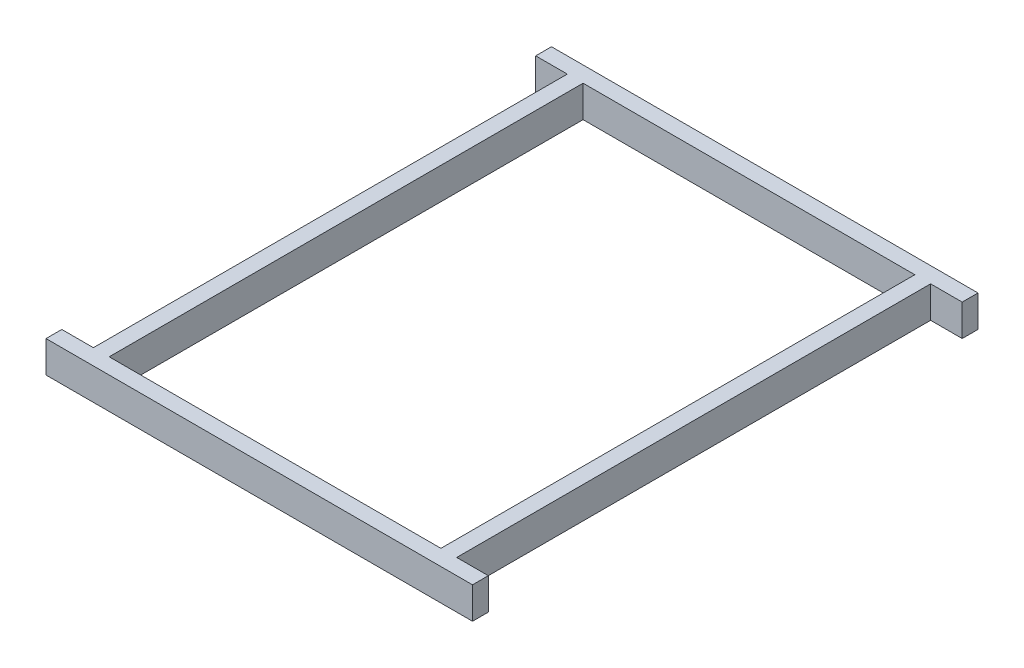
ISO-10303-21;
HEADER;
FILE_DESCRIPTION(('STEP AP214'),'2;1');
FILE_NAME('part.step','',(''),(''),'','','');
FILE_SCHEMA(('AUTOMOTIVE_DESIGN { 1 0 10303 214 1 1 1 1 }'));
ENDSEC;
DATA;
#1=APPLICATION_CONTEXT('core data for automotive mechanical design processes');
#2=APPLICATION_PROTOCOL_DEFINITION('international standard','automotive_design',2000,#1);
#3=PRODUCT_CONTEXT('',#1,'mechanical');
#4=PRODUCT('Part','Part','',(#3));
#5=PRODUCT_RELATED_PRODUCT_CATEGORY('part','',(#4));
#6=PRODUCT_DEFINITION_FORMATION('','',#4);
#7=PRODUCT_DEFINITION_CONTEXT('part definition',#1,'design');
#8=PRODUCT_DEFINITION('design','',#6,#7);
#9=PRODUCT_DEFINITION_SHAPE('','',#8);
#10=(LENGTH_UNIT() NAMED_UNIT(*) SI_UNIT(.MILLI.,.METRE.));
#11=(NAMED_UNIT(*) PLANE_ANGLE_UNIT() SI_UNIT($,.RADIAN.));
#12=(NAMED_UNIT(*) SI_UNIT($,.STERADIAN.) SOLID_ANGLE_UNIT());
#13=UNCERTAINTY_MEASURE_WITH_UNIT(LENGTH_MEASURE(1.E-05),#10,'distance_accuracy_value','');
#14=(GEOMETRIC_REPRESENTATION_CONTEXT(3) GLOBAL_UNCERTAINTY_ASSIGNED_CONTEXT((#13)) GLOBAL_UNIT_ASSIGNED_CONTEXT((#10,
#11,#12)) REPRESENTATION_CONTEXT('',''));
#15=CARTESIAN_POINT('',(0.,0.,0.));
#16=DIRECTION('',(0.,0.,1.));
#17=DIRECTION('',(1.,0.,0.));
#18=AXIS2_PLACEMENT_3D('',#15,#16,#17);
#19=CARTESIAN_POINT('',(0.,50.8,0.));
#20=DIRECTION('',(0.,1.,0.));
#21=DIRECTION('',(0.,0.,1.));
#22=AXIS2_PLACEMENT_3D('',#19,#20,#21);
#23=PLANE('',#22);
#24=DIRECTION('',(0.,0.,1.));
#25=VECTOR('',#24,1.);
#26=CARTESIAN_POINT('',(-342.9,50.8,-25.4));
#27=LINE('',#26,#25);
#28=CARTESIAN_POINT('',(-342.9,50.8,-25.4));
#29=VERTEX_POINT('',#28);
#30=CARTESIAN_POINT('',(-342.9,50.8,0.));
#31=VERTEX_POINT('',#30);
#32=EDGE_CURVE('E182',#29,#31,#27,.T.);
#33=ORIENTED_EDGE('',*,*,#32,.T.);
#34=DIRECTION('',(1.,0.,0.));
#35=VECTOR('',#34,1.);
#36=CARTESIAN_POINT('',(-342.9,50.8,0.));
#37=LINE('',#36,#35);
#38=CARTESIAN_POINT('',(342.9,50.8,-1.25979416228288E-13));
#39=VERTEX_POINT('',#38);
#40=EDGE_CURVE('E185',#31,#39,#37,.T.);
#41=ORIENTED_EDGE('',*,*,#40,.T.);
#42=DIRECTION('',(0.,0.,-1.));
#43=VECTOR('',#42,1.);
#44=CARTESIAN_POINT('',(342.9,50.8,-1.25979416228288E-13));
#45=LINE('',#44,#43);
#46=CARTESIAN_POINT('',(342.9,50.8,-25.4));
#47=VERTEX_POINT('',#46);
#48=EDGE_CURVE('E188',#39,#47,#45,.T.);
#49=ORIENTED_EDGE('',*,*,#48,.T.);
#50=DIRECTION('',(-1.,0.,0.));
#51=VECTOR('',#50,1.);
#52=CARTESIAN_POINT('',(342.9,50.8,-25.4));
#53=LINE('',#52,#51);
#54=CARTESIAN_POINT('',(292.1,50.8,-25.4));
#55=VERTEX_POINT('',#54);
#56=EDGE_CURVE('E190',#47,#55,#53,.T.);
#57=ORIENTED_EDGE('',*,*,#56,.T.);
#58=DIRECTION('',(0.,0.,-1.));
#59=VECTOR('',#58,1.);
#60=CARTESIAN_POINT('',(292.1,50.8,-25.4));
#61=LINE('',#60,#59);
#62=CARTESIAN_POINT('',(292.1,50.8,-787.4));
#63=VERTEX_POINT('',#62);
#64=EDGE_CURVE('E192',#55,#63,#61,.T.);
#65=ORIENTED_EDGE('',*,*,#64,.T.);
#66=DIRECTION('',(1.,0.,0.));
#67=VECTOR('',#66,1.);
#68=CARTESIAN_POINT('',(292.1,50.8,-787.4));
#69=LINE('',#68,#67);
#70=CARTESIAN_POINT('',(342.9,50.8,-787.4));
#71=VERTEX_POINT('',#70);
#72=EDGE_CURVE('E194',#63,#71,#69,.T.);
#73=ORIENTED_EDGE('',*,*,#72,.T.);
#74=DIRECTION('',(0.,0.,-1.));
#75=VECTOR('',#74,1.);
#76=CARTESIAN_POINT('',(342.9,50.8,-787.4));
#77=LINE('',#76,#75);
#78=CARTESIAN_POINT('',(342.9,50.8,-812.8));
#79=VERTEX_POINT('',#78);
#80=EDGE_CURVE('E196',#71,#79,#77,.T.);
#81=ORIENTED_EDGE('',*,*,#80,.T.);
#82=DIRECTION('',(-1.,0.,0.));
#83=VECTOR('',#82,1.);
#84=CARTESIAN_POINT('',(342.9,50.8,-812.8));
#85=LINE('',#84,#83);
#86=CARTESIAN_POINT('',(-342.9,50.8,-812.8));
#87=VERTEX_POINT('',#86);
#88=EDGE_CURVE('E198',#79,#87,#85,.T.);
#89=ORIENTED_EDGE('',*,*,#88,.T.);
#90=DIRECTION('',(0.,0.,1.));
#91=VECTOR('',#90,1.);
#92=CARTESIAN_POINT('',(-342.9,50.8,-812.8));
#93=LINE('',#92,#91);
#94=CARTESIAN_POINT('',(-342.9,50.8,-787.4));
#95=VERTEX_POINT('',#94);
#96=EDGE_CURVE('E200',#87,#95,#93,.T.);
#97=ORIENTED_EDGE('',*,*,#96,.T.);
#98=DIRECTION('',(1.,0.,0.));
#99=VECTOR('',#98,1.);
#100=CARTESIAN_POINT('',(-342.9,50.8,-787.4));
#101=LINE('',#100,#99);
#102=CARTESIAN_POINT('',(-292.1,50.8,-787.4));
#103=VERTEX_POINT('',#102);
#104=EDGE_CURVE('E202',#95,#103,#101,.T.);
#105=ORIENTED_EDGE('',*,*,#104,.T.);
#106=DIRECTION('',(0.,0.,1.));
#107=VECTOR('',#106,1.);
#108=CARTESIAN_POINT('',(-292.1,50.8,-787.4));
#109=LINE('',#108,#107);
#110=CARTESIAN_POINT('',(-292.1,50.8,-25.3999999999999));
#111=VERTEX_POINT('',#110);
#112=EDGE_CURVE('E204',#103,#111,#109,.T.);
#113=ORIENTED_EDGE('',*,*,#112,.T.);
#114=DIRECTION('',(-1.,0.,0.));
#115=VECTOR('',#114,1.);
#116=CARTESIAN_POINT('',(-292.1,50.8,-25.3999999999999));
#117=LINE('',#116,#115);
#118=EDGE_CURVE('E206',#111,#29,#117,.T.);
#119=ORIENTED_EDGE('',*,*,#118,.T.);
#120=EDGE_LOOP('',(#33,#41,#49,#57,#65,#73,#81,#89,#97,#105,#113,#119));
#121=FACE_BOUND('',#120,.T.);
#122=DIRECTION('',(1.,0.,0.));
#123=VECTOR('',#122,1.);
#124=CARTESIAN_POINT('',(-266.7,50.8,-25.4));
#125=LINE('',#124,#123);
#126=CARTESIAN_POINT('',(-266.7,50.8,-25.4));
#127=VERTEX_POINT('',#126);
#128=CARTESIAN_POINT('',(266.7,50.8,-25.4));
#129=VERTEX_POINT('',#128);
#130=EDGE_CURVE('E154',#127,#129,#125,.T.);
#131=ORIENTED_EDGE('',*,*,#130,.F.);
#132=DIRECTION('',(0.,0.,1.));
#133=VECTOR('',#132,1.);
#134=CARTESIAN_POINT('',(-266.7,50.8,-787.4));
#135=LINE('',#134,#133);
#136=CARTESIAN_POINT('',(-266.7,50.8,-787.4));
#137=VERTEX_POINT('',#136);
#138=EDGE_CURVE('E146',#137,#127,#135,.T.);
#139=ORIENTED_EDGE('',*,*,#138,.F.);
#140=DIRECTION('',(-1.,0.,0.));
#141=VECTOR('',#140,1.);
#142=CARTESIAN_POINT('',(-266.7,50.8,-787.4));
#143=LINE('',#142,#141);
#144=CARTESIAN_POINT('',(266.7,50.8,-787.4));
#145=VERTEX_POINT('',#144);
#146=EDGE_CURVE('E168',#145,#137,#143,.T.);
#147=ORIENTED_EDGE('',*,*,#146,.F.);
#148=DIRECTION('',(0.,0.,-1.));
#149=VECTOR('',#148,1.);
#150=CARTESIAN_POINT('',(266.7,50.8,-787.4));
#151=LINE('',#150,#149);
#152=EDGE_CURVE('E166',#129,#145,#151,.T.);
#153=ORIENTED_EDGE('',*,*,#152,.F.);
#154=EDGE_LOOP('',(#131,#139,#147,#153));
#155=FACE_BOUND('',#154,.T.);
#156=ADVANCED_FACE('F33',(#121,#155),#23,.T.);
#157=CARTESIAN_POINT('',(0.,0.,0.));
#158=DIRECTION('',(0.,1.,0.));
#159=DIRECTION('',(0.,0.,1.));
#160=AXIS2_PLACEMENT_3D('',#157,#158,#159);
#161=PLANE('',#160);
#162=DIRECTION('',(0.,0.,1.));
#163=VECTOR('',#162,1.);
#164=CARTESIAN_POINT('',(-342.9,0.,-25.4));
#165=LINE('',#164,#163);
#166=CARTESIAN_POINT('',(-342.9,0.,-25.4));
#167=VERTEX_POINT('',#166);
#168=CARTESIAN_POINT('',(-342.9,0.,0.));
#169=VERTEX_POINT('',#168);
#170=EDGE_CURVE('E162',#167,#169,#165,.T.);
#171=ORIENTED_EDGE('',*,*,#170,.F.);
#172=DIRECTION('',(-1.,0.,0.));
#173=VECTOR('',#172,1.);
#174=CARTESIAN_POINT('',(-292.1,0.,-25.3999999999999));
#175=LINE('',#174,#173);
#176=CARTESIAN_POINT('',(-292.1,0.,-25.3999999999999));
#177=VERTEX_POINT('',#176);
#178=EDGE_CURVE('E186',#177,#167,#175,.T.);
#179=ORIENTED_EDGE('',*,*,#178,.F.);
#180=DIRECTION('',(0.,0.,1.));
#181=VECTOR('',#180,1.);
#182=CARTESIAN_POINT('',(-292.1,0.,-787.4));
#183=LINE('',#182,#181);
#184=CARTESIAN_POINT('',(-292.1,0.,-787.4));
#185=VERTEX_POINT('',#184);
#186=EDGE_CURVE('E229',#185,#177,#183,.T.);
#187=ORIENTED_EDGE('',*,*,#186,.F.);
#188=DIRECTION('',(1.,0.,0.));
#189=VECTOR('',#188,1.);
#190=CARTESIAN_POINT('',(-342.9,0.,-787.4));
#191=LINE('',#190,#189);
#192=CARTESIAN_POINT('',(-342.9,0.,-787.4));
#193=VERTEX_POINT('',#192);
#194=EDGE_CURVE('E227',#193,#185,#191,.T.);
#195=ORIENTED_EDGE('',*,*,#194,.F.);
#196=DIRECTION('',(0.,0.,1.));
#197=VECTOR('',#196,1.);
#198=CARTESIAN_POINT('',(-342.9,0.,-812.8));
#199=LINE('',#198,#197);
#200=CARTESIAN_POINT('',(-342.9,0.,-812.8));
#201=VERTEX_POINT('',#200);
#202=EDGE_CURVE('E225',#201,#193,#199,.T.);
#203=ORIENTED_EDGE('',*,*,#202,.F.);
#204=DIRECTION('',(-1.,0.,0.));
#205=VECTOR('',#204,1.);
#206=CARTESIAN_POINT('',(342.9,0.,-812.8));
#207=LINE('',#206,#205);
#208=CARTESIAN_POINT('',(342.9,0.,-812.8));
#209=VERTEX_POINT('',#208);
#210=EDGE_CURVE('E223',#209,#201,#207,.T.);
#211=ORIENTED_EDGE('',*,*,#210,.F.);
#212=DIRECTION('',(0.,0.,-1.));
#213=VECTOR('',#212,1.);
#214=CARTESIAN_POINT('',(342.9,0.,-787.4));
#215=LINE('',#214,#213);
#216=CARTESIAN_POINT('',(342.9,0.,-787.4));
#217=VERTEX_POINT('',#216);
#218=EDGE_CURVE('E221',#217,#209,#215,.T.);
#219=ORIENTED_EDGE('',*,*,#218,.F.);
#220=DIRECTION('',(1.,0.,0.));
#221=VECTOR('',#220,1.);
#222=CARTESIAN_POINT('',(292.1,0.,-787.4));
#223=LINE('',#222,#221);
#224=CARTESIAN_POINT('',(292.1,0.,-787.4));
#225=VERTEX_POINT('',#224);
#226=EDGE_CURVE('E219',#225,#217,#223,.T.);
#227=ORIENTED_EDGE('',*,*,#226,.F.);
#228=DIRECTION('',(0.,0.,-1.));
#229=VECTOR('',#228,1.);
#230=CARTESIAN_POINT('',(292.1,0.,-25.4));
#231=LINE('',#230,#229);
#232=CARTESIAN_POINT('',(292.1,0.,-25.4));
#233=VERTEX_POINT('',#232);
#234=EDGE_CURVE('E217',#233,#225,#231,.T.);
#235=ORIENTED_EDGE('',*,*,#234,.F.);
#236=DIRECTION('',(-1.,0.,0.));
#237=VECTOR('',#236,1.);
#238=CARTESIAN_POINT('',(342.9,0.,-25.4));
#239=LINE('',#238,#237);
#240=CARTESIAN_POINT('',(342.9,0.,-25.4));
#241=VERTEX_POINT('',#240);
#242=EDGE_CURVE('E215',#241,#233,#239,.T.);
#243=ORIENTED_EDGE('',*,*,#242,.F.);
#244=DIRECTION('',(0.,0.,-1.));
#245=VECTOR('',#244,1.);
#246=CARTESIAN_POINT('',(342.9,0.,-1.25979416228288E-13));
#247=LINE('',#246,#245);
#248=CARTESIAN_POINT('',(342.9,0.,-1.25979416228288E-13));
#249=VERTEX_POINT('',#248);
#250=EDGE_CURVE('E213',#249,#241,#247,.T.);
#251=ORIENTED_EDGE('',*,*,#250,.F.);
#252=DIRECTION('',(1.,0.,0.));
#253=VECTOR('',#252,1.);
#254=CARTESIAN_POINT('',(-342.9,0.,0.));
#255=LINE('',#254,#253);
#256=EDGE_CURVE('E211',#169,#249,#255,.T.);
#257=ORIENTED_EDGE('',*,*,#256,.F.);
#258=EDGE_LOOP('',(#171,#179,#187,#195,#203,#211,#219,#227,#235,#243,#251,#257));
#259=FACE_BOUND('',#258,.T.);
#260=DIRECTION('',(0.,0.,1.));
#261=VECTOR('',#260,1.);
#262=CARTESIAN_POINT('',(-266.7,0.,-787.4));
#263=LINE('',#262,#261);
#264=CARTESIAN_POINT('',(-266.7,0.,-787.4));
#265=VERTEX_POINT('',#264);
#266=CARTESIAN_POINT('',(-266.7,0.,-25.4));
#267=VERTEX_POINT('',#266);
#268=EDGE_CURVE('E56',#265,#267,#263,.T.);
#269=ORIENTED_EDGE('',*,*,#268,.T.);
#270=DIRECTION('',(1.,0.,0.));
#271=VECTOR('',#270,1.);
#272=CARTESIAN_POINT('',(-266.7,0.,-25.4));
#273=LINE('',#272,#271);
#274=CARTESIAN_POINT('',(266.7,0.,-25.4));
#275=VERTEX_POINT('',#274);
#276=EDGE_CURVE('E161',#267,#275,#273,.T.);
#277=ORIENTED_EDGE('',*,*,#276,.T.);
#278=DIRECTION('',(0.,0.,-1.));
#279=VECTOR('',#278,1.);
#280=CARTESIAN_POINT('',(266.7,0.,-787.4));
#281=LINE('',#280,#279);
#282=CARTESIAN_POINT('',(266.7,0.,-787.4));
#283=VERTEX_POINT('',#282);
#284=EDGE_CURVE('E174',#275,#283,#281,.T.);
#285=ORIENTED_EDGE('',*,*,#284,.T.);
#286=DIRECTION('',(-1.,0.,0.));
#287=VECTOR('',#286,1.);
#288=CARTESIAN_POINT('',(-266.7,0.,-787.4));
#289=LINE('',#288,#287);
#290=EDGE_CURVE('E155',#283,#265,#289,.T.);
#291=ORIENTED_EDGE('',*,*,#290,.T.);
#292=EDGE_LOOP('',(#269,#277,#285,#291));
#293=FACE_BOUND('',#292,.T.);
#294=ADVANCED_FACE('F271',(#259,#293),#161,.F.);
#295=CARTESIAN_POINT('',(-342.9,50.8,-25.4));
#296=DIRECTION('',(1.,0.,0.));
#297=DIRECTION('',(0.,0.,-1.));
#298=AXIS2_PLACEMENT_3D('',#295,#296,#297);
#299=PLANE('',#298);
#300=ORIENTED_EDGE('',*,*,#170,.T.);
#301=DIRECTION('',(0.,-1.,0.));
#302=VECTOR('',#301,1.);
#303=CARTESIAN_POINT('',(-342.9,50.8,0.));
#304=LINE('',#303,#302);
#305=EDGE_CURVE('E11',#31,#169,#304,.T.);
#306=ORIENTED_EDGE('',*,*,#305,.F.);
#307=ORIENTED_EDGE('',*,*,#32,.F.);
#308=DIRECTION('',(0.,-1.,0.));
#309=VECTOR('',#308,1.);
#310=CARTESIAN_POINT('',(-342.9,50.8,-25.4));
#311=LINE('',#310,#309);
#312=EDGE_CURVE('E208',#29,#167,#311,.T.);
#313=ORIENTED_EDGE('',*,*,#312,.T.);
#314=EDGE_LOOP('',(#300,#306,#307,#313));
#315=FACE_BOUND('',#314,.T.);
#316=ADVANCED_FACE('F35',(#315),#299,.F.);
#317=CARTESIAN_POINT('',(-342.9,50.8,0.));
#318=DIRECTION('',(0.,0.,-1.));
#319=DIRECTION('',(-1.,0.,0.));
#320=AXIS2_PLACEMENT_3D('',#317,#318,#319);
#321=PLANE('',#320);
#322=ORIENTED_EDGE('',*,*,#256,.T.);
#323=DIRECTION('',(0.,-1.,0.));
#324=VECTOR('',#323,1.);
#325=CARTESIAN_POINT('',(342.9,50.8,-1.25979416228288E-13));
#326=LINE('',#325,#324);
#327=EDGE_CURVE('E41',#39,#249,#326,.T.);
#328=ORIENTED_EDGE('',*,*,#327,.F.);
#329=ORIENTED_EDGE('',*,*,#40,.F.);
#330=ORIENTED_EDGE('',*,*,#305,.T.);
#331=EDGE_LOOP('',(#322,#328,#329,#330));
#332=FACE_BOUND('',#331,.T.);
#333=ADVANCED_FACE('F288',(#332),#321,.F.);
#334=CARTESIAN_POINT('',(342.9,50.8,-1.25979416228288E-13));
#335=DIRECTION('',(-1.,0.,0.));
#336=DIRECTION('',(0.,0.,1.));
#337=AXIS2_PLACEMENT_3D('',#334,#335,#336);
#338=PLANE('',#337);
#339=ORIENTED_EDGE('',*,*,#250,.T.);
#340=DIRECTION('',(0.,-1.,0.));
#341=VECTOR('',#340,1.);
#342=CARTESIAN_POINT('',(342.9,50.8,-25.4));
#343=LINE('',#342,#341);
#344=EDGE_CURVE('E258',#47,#241,#343,.T.);
#345=ORIENTED_EDGE('',*,*,#344,.F.);
#346=ORIENTED_EDGE('',*,*,#48,.F.);
#347=ORIENTED_EDGE('',*,*,#327,.T.);
#348=EDGE_LOOP('',(#339,#345,#346,#347));
#349=FACE_BOUND('',#348,.T.);
#350=ADVANCED_FACE('F265',(#349),#338,.F.);
#351=CARTESIAN_POINT('',(342.9,50.8,-25.4));
#352=DIRECTION('',(0.,0.,1.));
#353=DIRECTION('',(1.,0.,0.));
#354=AXIS2_PLACEMENT_3D('',#351,#352,#353);
#355=PLANE('',#354);
#356=ORIENTED_EDGE('',*,*,#242,.T.);
#357=DIRECTION('',(0.,-1.,0.));
#358=VECTOR('',#357,1.);
#359=CARTESIAN_POINT('',(292.1,50.8,-25.4));
#360=LINE('',#359,#358);
#361=EDGE_CURVE('E255',#55,#233,#360,.T.);
#362=ORIENTED_EDGE('',*,*,#361,.F.);
#363=ORIENTED_EDGE('',*,*,#56,.F.);
#364=ORIENTED_EDGE('',*,*,#344,.T.);
#365=EDGE_LOOP('',(#356,#362,#363,#364));
#366=FACE_BOUND('',#365,.T.);
#367=ADVANCED_FACE('F277',(#366),#355,.F.);
#368=CARTESIAN_POINT('',(292.1,50.8,-25.4));
#369=DIRECTION('',(-1.,0.,0.));
#370=DIRECTION('',(0.,0.,1.));
#371=AXIS2_PLACEMENT_3D('',#368,#369,#370);
#372=PLANE('',#371);
#373=ORIENTED_EDGE('',*,*,#234,.T.);
#374=DIRECTION('',(0.,-1.,0.));
#375=VECTOR('',#374,1.);
#376=CARTESIAN_POINT('',(292.1,50.8,-787.4));
#377=LINE('',#376,#375);
#378=EDGE_CURVE('E252',#63,#225,#377,.T.);
#379=ORIENTED_EDGE('',*,*,#378,.F.);
#380=ORIENTED_EDGE('',*,*,#64,.F.);
#381=ORIENTED_EDGE('',*,*,#361,.T.);
#382=EDGE_LOOP('',(#373,#379,#380,#381));
#383=FACE_BOUND('',#382,.T.);
#384=ADVANCED_FACE('F281',(#383),#372,.F.);
#385=CARTESIAN_POINT('',(292.1,50.8,-787.4));
#386=DIRECTION('',(0.,0.,-1.));
#387=DIRECTION('',(-1.,0.,0.));
#388=AXIS2_PLACEMENT_3D('',#385,#386,#387);
#389=PLANE('',#388);
#390=ORIENTED_EDGE('',*,*,#226,.T.);
#391=DIRECTION('',(0.,-1.,0.));
#392=VECTOR('',#391,1.);
#393=CARTESIAN_POINT('',(342.9,50.8,-787.4));
#394=LINE('',#393,#392);
#395=EDGE_CURVE('E249',#71,#217,#394,.T.);
#396=ORIENTED_EDGE('',*,*,#395,.F.);
#397=ORIENTED_EDGE('',*,*,#72,.F.);
#398=ORIENTED_EDGE('',*,*,#378,.T.);
#399=EDGE_LOOP('',(#390,#396,#397,#398));
#400=FACE_BOUND('',#399,.T.);
#401=ADVANCED_FACE('F321',(#400),#389,.F.);
#402=CARTESIAN_POINT('',(342.9,50.8,-787.4));
#403=DIRECTION('',(-1.,0.,0.));
#404=DIRECTION('',(0.,0.,1.));
#405=AXIS2_PLACEMENT_3D('',#402,#403,#404);
#406=PLANE('',#405);
#407=ORIENTED_EDGE('',*,*,#218,.T.);
#408=DIRECTION('',(0.,-1.,0.));
#409=VECTOR('',#408,1.);
#410=CARTESIAN_POINT('',(342.9,50.8,-812.8));
#411=LINE('',#410,#409);
#412=EDGE_CURVE('E246',#79,#209,#411,.T.);
#413=ORIENTED_EDGE('',*,*,#412,.F.);
#414=ORIENTED_EDGE('',*,*,#80,.F.);
#415=ORIENTED_EDGE('',*,*,#395,.T.);
#416=EDGE_LOOP('',(#407,#413,#414,#415));
#417=FACE_BOUND('',#416,.T.);
#418=ADVANCED_FACE('F319',(#417),#406,.F.);
#419=CARTESIAN_POINT('',(342.9,50.8,-812.8));
#420=DIRECTION('',(0.,0.,1.));
#421=DIRECTION('',(1.,0.,0.));
#422=AXIS2_PLACEMENT_3D('',#419,#420,#421);
#423=PLANE('',#422);
#424=ORIENTED_EDGE('',*,*,#210,.T.);
#425=DIRECTION('',(0.,-1.,0.));
#426=VECTOR('',#425,1.);
#427=CARTESIAN_POINT('',(-342.9,50.8,-812.8));
#428=LINE('',#427,#426);
#429=EDGE_CURVE('E243',#87,#201,#428,.T.);
#430=ORIENTED_EDGE('',*,*,#429,.F.);
#431=ORIENTED_EDGE('',*,*,#88,.F.);
#432=ORIENTED_EDGE('',*,*,#412,.T.);
#433=EDGE_LOOP('',(#424,#430,#431,#432));
#434=FACE_BOUND('',#433,.T.);
#435=ADVANCED_FACE('F315',(#434),#423,.F.);
#436=CARTESIAN_POINT('',(-342.9,50.8,-812.8));
#437=DIRECTION('',(1.,0.,0.));
#438=DIRECTION('',(0.,0.,-1.));
#439=AXIS2_PLACEMENT_3D('',#436,#437,#438);
#440=PLANE('',#439);
#441=ORIENTED_EDGE('',*,*,#202,.T.);
#442=DIRECTION('',(0.,-1.,0.));
#443=VECTOR('',#442,1.);
#444=CARTESIAN_POINT('',(-342.9,50.8,-787.4));
#445=LINE('',#444,#443);
#446=EDGE_CURVE('E240',#95,#193,#445,.T.);
#447=ORIENTED_EDGE('',*,*,#446,.F.);
#448=ORIENTED_EDGE('',*,*,#96,.F.);
#449=ORIENTED_EDGE('',*,*,#429,.T.);
#450=EDGE_LOOP('',(#441,#447,#448,#449));
#451=FACE_BOUND('',#450,.T.);
#452=ADVANCED_FACE('F310',(#451),#440,.F.);
#453=CARTESIAN_POINT('',(-342.9,50.8,-787.4));
#454=DIRECTION('',(0.,0.,-1.));
#455=DIRECTION('',(-1.,0.,0.));
#456=AXIS2_PLACEMENT_3D('',#453,#454,#455);
#457=PLANE('',#456);
#458=ORIENTED_EDGE('',*,*,#194,.T.);
#459=DIRECTION('',(0.,-1.,0.));
#460=VECTOR('',#459,1.);
#461=CARTESIAN_POINT('',(-292.1,50.8,-787.4));
#462=LINE('',#461,#460);
#463=EDGE_CURVE('E237',#103,#185,#462,.T.);
#464=ORIENTED_EDGE('',*,*,#463,.F.);
#465=ORIENTED_EDGE('',*,*,#104,.F.);
#466=ORIENTED_EDGE('',*,*,#446,.T.);
#467=EDGE_LOOP('',(#458,#464,#465,#466));
#468=FACE_BOUND('',#467,.T.);
#469=ADVANCED_FACE('F304',(#468),#457,.F.);
#470=CARTESIAN_POINT('',(-292.1,50.8,-787.4));
#471=DIRECTION('',(1.,0.,0.));
#472=DIRECTION('',(0.,0.,-1.));
#473=AXIS2_PLACEMENT_3D('',#470,#471,#472);
#474=PLANE('',#473);
#475=ORIENTED_EDGE('',*,*,#186,.T.);
#476=DIRECTION('',(0.,-1.,0.));
#477=VECTOR('',#476,1.);
#478=CARTESIAN_POINT('',(-292.1,50.8,-25.3999999999999));
#479=LINE('',#478,#477);
#480=EDGE_CURVE('E234',#111,#177,#479,.T.);
#481=ORIENTED_EDGE('',*,*,#480,.F.);
#482=ORIENTED_EDGE('',*,*,#112,.F.);
#483=ORIENTED_EDGE('',*,*,#463,.T.);
#484=EDGE_LOOP('',(#475,#481,#482,#483));
#485=FACE_BOUND('',#484,.T.);
#486=ADVANCED_FACE('F300',(#485),#474,.F.);
#487=CARTESIAN_POINT('',(-292.1,50.8,-25.3999999999999));
#488=DIRECTION('',(0.,0.,1.));
#489=DIRECTION('',(1.,0.,0.));
#490=AXIS2_PLACEMENT_3D('',#487,#488,#489);
#491=PLANE('',#490);
#492=ORIENTED_EDGE('',*,*,#178,.T.);
#493=ORIENTED_EDGE('',*,*,#312,.F.);
#494=ORIENTED_EDGE('',*,*,#118,.F.);
#495=ORIENTED_EDGE('',*,*,#480,.T.);
#496=EDGE_LOOP('',(#492,#493,#494,#495));
#497=FACE_BOUND('',#496,.T.);
#498=ADVANCED_FACE('F295',(#497),#491,.F.);
#499=CARTESIAN_POINT('',(-266.7,50.8,-787.4));
#500=DIRECTION('',(1.,0.,0.));
#501=DIRECTION('',(0.,0.,-1.));
#502=AXIS2_PLACEMENT_3D('',#499,#500,#501);
#503=PLANE('',#502);
#504=ORIENTED_EDGE('',*,*,#268,.F.);
#505=DIRECTION('',(0.,-1.,0.));
#506=VECTOR('',#505,1.);
#507=CARTESIAN_POINT('',(-266.7,50.8,-787.4));
#508=LINE('',#507,#506);
#509=EDGE_CURVE('E150',#137,#265,#508,.T.);
#510=ORIENTED_EDGE('',*,*,#509,.F.);
#511=ORIENTED_EDGE('',*,*,#138,.T.);
#512=DIRECTION('',(0.,-1.,0.));
#513=VECTOR('',#512,1.);
#514=CARTESIAN_POINT('',(-266.7,50.8,-25.4));
#515=LINE('',#514,#513);
#516=EDGE_CURVE('E149',#127,#267,#515,.T.);
#517=ORIENTED_EDGE('',*,*,#516,.T.);
#518=EDGE_LOOP('',(#504,#510,#511,#517));
#519=FACE_BOUND('',#518,.T.);
#520=ADVANCED_FACE('F148',(#519),#503,.T.);
#521=CARTESIAN_POINT('',(-266.7,50.8,-25.4));
#522=DIRECTION('',(0.,0.,-1.));
#523=DIRECTION('',(-1.,0.,0.));
#524=AXIS2_PLACEMENT_3D('',#521,#522,#523);
#525=PLANE('',#524);
#526=ORIENTED_EDGE('',*,*,#276,.F.);
#527=ORIENTED_EDGE('',*,*,#516,.F.);
#528=ORIENTED_EDGE('',*,*,#130,.T.);
#529=DIRECTION('',(0.,-1.,0.));
#530=VECTOR('',#529,1.);
#531=CARTESIAN_POINT('',(266.7,50.8,-25.4));
#532=LINE('',#531,#530);
#533=EDGE_CURVE('E163',#129,#275,#532,.T.);
#534=ORIENTED_EDGE('',*,*,#533,.T.);
#535=EDGE_LOOP('',(#526,#527,#528,#534));
#536=FACE_BOUND('',#535,.T.);
#537=ADVANCED_FACE('F158',(#536),#525,.T.);
#538=CARTESIAN_POINT('',(266.7,50.8,-787.4));
#539=DIRECTION('',(-1.,0.,0.));
#540=DIRECTION('',(0.,0.,1.));
#541=AXIS2_PLACEMENT_3D('',#538,#539,#540);
#542=PLANE('',#541);
#543=ORIENTED_EDGE('',*,*,#284,.F.);
#544=ORIENTED_EDGE('',*,*,#533,.F.);
#545=ORIENTED_EDGE('',*,*,#152,.T.);
#546=DIRECTION('',(0.,-1.,0.));
#547=VECTOR('',#546,1.);
#548=CARTESIAN_POINT('',(266.7,50.8,-787.4));
#549=LINE('',#548,#547);
#550=EDGE_CURVE('E48',#145,#283,#549,.T.);
#551=ORIENTED_EDGE('',*,*,#550,.T.);
#552=EDGE_LOOP('',(#543,#544,#545,#551));
#553=FACE_BOUND('',#552,.T.);
#554=ADVANCED_FACE('F379',(#553),#542,.T.);
#555=CARTESIAN_POINT('',(-266.7,50.8,-787.4));
#556=DIRECTION('',(0.,0.,1.));
#557=DIRECTION('',(1.,0.,0.));
#558=AXIS2_PLACEMENT_3D('',#555,#556,#557);
#559=PLANE('',#558);
#560=ORIENTED_EDGE('',*,*,#290,.F.);
#561=ORIENTED_EDGE('',*,*,#550,.F.);
#562=ORIENTED_EDGE('',*,*,#146,.T.);
#563=ORIENTED_EDGE('',*,*,#509,.T.);
#564=EDGE_LOOP('',(#560,#561,#562,#563));
#565=FACE_BOUND('',#564,.T.);
#566=ADVANCED_FACE('F385',(#565),#559,.T.);
#567=CLOSED_SHELL('',(#156,#294,#316,#333,#350,#367,#384,#401,#418,#435,#452,#469,#486,#498,
#520,#537,#554,#566));
#568=MANIFOLD_SOLID_BREP('B2',#567);
#569=ADVANCED_BREP_SHAPE_REPRESENTATION('',(#18,#568),#14);
#570=SHAPE_DEFINITION_REPRESENTATION(#9,#569);
ENDSEC;
END-ISO-10303-21;
